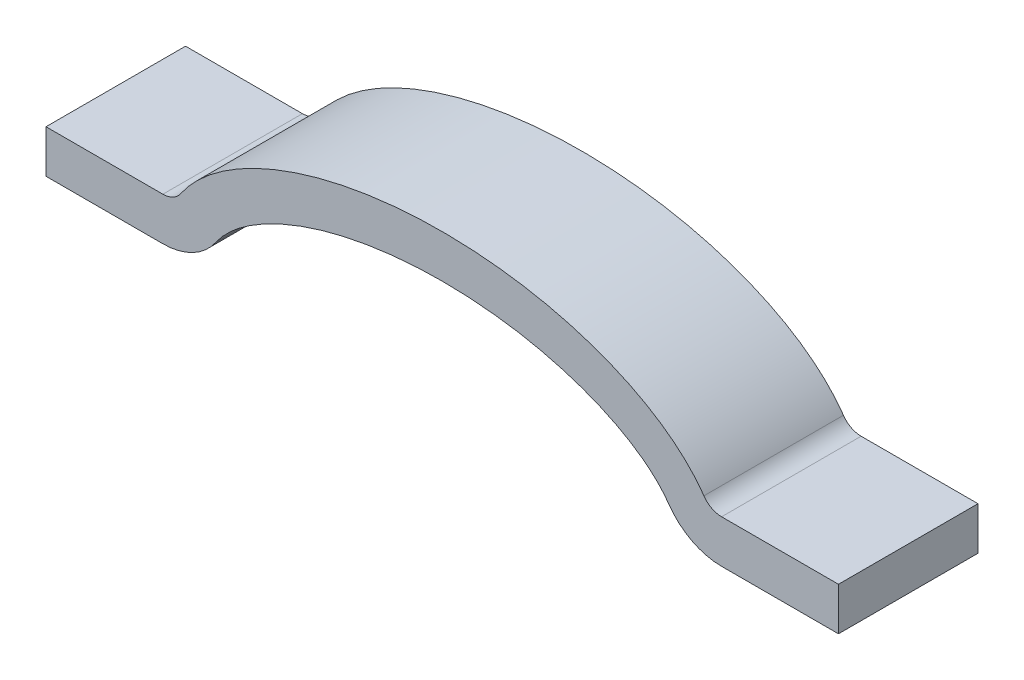
ISO-10303-21;
HEADER;
FILE_DESCRIPTION(('STEP AP214'),'2;1');
FILE_NAME('part.step','',(''),(''),'','','');
FILE_SCHEMA(('AUTOMOTIVE_DESIGN { 1 0 10303 214 1 1 1 1 }'));
ENDSEC;
DATA;
#1=APPLICATION_CONTEXT('core data for automotive mechanical design processes');
#2=APPLICATION_PROTOCOL_DEFINITION('international standard','automotive_design',2000,#1);
#3=PRODUCT_CONTEXT('',#1,'mechanical');
#4=PRODUCT('Part','Part','',(#3));
#5=PRODUCT_RELATED_PRODUCT_CATEGORY('part','',(#4));
#6=PRODUCT_DEFINITION_FORMATION('','',#4);
#7=PRODUCT_DEFINITION_CONTEXT('part definition',#1,'design');
#8=PRODUCT_DEFINITION('design','',#6,#7);
#9=PRODUCT_DEFINITION_SHAPE('','',#8);
#10=(LENGTH_UNIT() NAMED_UNIT(*) SI_UNIT(.MILLI.,.METRE.));
#11=(NAMED_UNIT(*) PLANE_ANGLE_UNIT() SI_UNIT($,.RADIAN.));
#12=(NAMED_UNIT(*) SI_UNIT($,.STERADIAN.) SOLID_ANGLE_UNIT());
#13=UNCERTAINTY_MEASURE_WITH_UNIT(LENGTH_MEASURE(1.E-05),#10,'distance_accuracy_value','');
#14=(GEOMETRIC_REPRESENTATION_CONTEXT(3) GLOBAL_UNCERTAINTY_ASSIGNED_CONTEXT((#13)) GLOBAL_UNIT_ASSIGNED_CONTEXT((#10,
#11,#12)) REPRESENTATION_CONTEXT('',''));
#15=CARTESIAN_POINT('',(0.,0.,0.));
#16=DIRECTION('',(0.,0.,1.));
#17=DIRECTION('',(1.,0.,0.));
#18=AXIS2_PLACEMENT_3D('',#15,#16,#17);
#19=CARTESIAN_POINT('',(36.9161860349977,0.,13.));
#20=DIRECTION('',(1.,0.,0.));
#21=DIRECTION('',(0.,0.,-1.));
#22=AXIS2_PLACEMENT_3D('',#19,#20,#21);
#23=PLANE('',#22);
#24=DIRECTION('',(0.,-1.,0.));
#25=VECTOR('',#24,1.);
#26=CARTESIAN_POINT('',(36.9161860349977,0.,0.));
#27=LINE('',#26,#25);
#28=CARTESIAN_POINT('',(36.9161860349977,4.,0.));
#29=VERTEX_POINT('',#28);
#30=CARTESIAN_POINT('',(36.9161860349977,0.,0.));
#31=VERTEX_POINT('',#30);
#32=EDGE_CURVE('E11',#29,#31,#27,.T.);
#33=ORIENTED_EDGE('',*,*,#32,.F.);
#34=DIRECTION('',(0.,0.,1.));
#35=VECTOR('',#34,1.);
#36=CARTESIAN_POINT('',(36.9161860349977,4.,13.));
#37=LINE('',#36,#35);
#38=CARTESIAN_POINT('',(36.9161860349977,4.,13.));
#39=VERTEX_POINT('',#38);
#40=EDGE_CURVE('E108',#39,#29,#37,.F.);
#41=ORIENTED_EDGE('',*,*,#40,.F.);
#42=DIRECTION('',(0.,-1.,0.));
#43=VECTOR('',#42,1.);
#44=CARTESIAN_POINT('',(36.9161860349977,0.,13.));
#45=LINE('',#44,#43);
#46=CARTESIAN_POINT('',(36.9161860349977,0.,13.));
#47=VERTEX_POINT('',#46);
#48=EDGE_CURVE('E46',#39,#47,#45,.T.);
#49=ORIENTED_EDGE('',*,*,#48,.T.);
#50=DIRECTION('',(0.,0.,-1.));
#51=VECTOR('',#50,1.);
#52=CARTESIAN_POINT('',(36.9161860349977,0.,13.));
#53=LINE('',#52,#51);
#54=EDGE_CURVE('E140',#47,#31,#53,.T.);
#55=ORIENTED_EDGE('',*,*,#54,.T.);
#56=EDGE_LOOP('',(#33,#41,#49,#55));
#57=FACE_BOUND('',#56,.T.);
#58=ADVANCED_FACE('F37',(#57),#23,.T.);
#59=CARTESIAN_POINT('',(-22.,0.,13.));
#60=DIRECTION('',(0.,0.,1.));
#61=DIRECTION('',(1.,0.,0.));
#62=AXIS2_PLACEMENT_3D('',#59,#60,#61);
#63=PLANE('',#62);
#64=DIRECTION('',(1.,0.,0.));
#65=VECTOR('',#64,1.);
#66=CARTESIAN_POINT('',(-22.,0.,13.));
#67=LINE('',#66,#65);
#68=CARTESIAN_POINT('',(-36.9161860349977,0.,13.));
#69=VERTEX_POINT('',#68);
#70=CARTESIAN_POINT('',(-26.0263948261629,0.,13.));
#71=VERTEX_POINT('',#70);
#72=EDGE_CURVE('E163',#69,#71,#67,.T.);
#73=ORIENTED_EDGE('',*,*,#72,.T.);
#74=CARTESIAN_POINT('',(-26.0263948261629,5.99999999999997,13.));
#75=DIRECTION('',(0.,0.,-1.));
#76=DIRECTION('',(-1.,0.,0.));
#77=AXIS2_PLACEMENT_3D('',#74,#75,#76);
#78=CIRCLE('',#77,6.);
#79=CARTESIAN_POINT('',(-21.083393892477,2.59900870780584,13.));
#80=VERTEX_POINT('',#79);
#81=EDGE_CURVE('E54',#71,#80,#78,.F.);
#82=ORIENTED_EDGE('',*,*,#81,.T.);
#83=CARTESIAN_POINT('',(-22.,0.,13.));
#84=CARTESIAN_POINT('',(-22.,0.432036641839711,13.));
#85=CARTESIAN_POINT('',(-21.8548863619666,1.29610992551914,13.));
#86=CARTESIAN_POINT('',(-20.9973878430744,2.88664464705841,13.));
#87=CARTESIAN_POINT('',(-19.2580049467167,4.66938679657808,13.));
#88=CARTESIAN_POINT('',(-15.7412521676776,6.99878575691308,13.));
#89=CARTESIAN_POINT('',(-9.3643610379705,9.3281522587363,13.));
#90=CARTESIAN_POINT('',(0.,10.3359238706319,13.));
#91=CARTESIAN_POINT('',(9.36436103797051,9.3281522587363,13.));
#92=CARTESIAN_POINT('',(15.7412521676776,6.99878575691308,13.));
#93=CARTESIAN_POINT('',(19.2580049467167,4.66938679657808,13.));
#94=CARTESIAN_POINT('',(20.9973878430744,2.8866446470584,13.));
#95=CARTESIAN_POINT('',(21.8548863619666,1.29610992551914,13.));
#96=CARTESIAN_POINT('',(22.,0.432036641839715,13.));
#97=CARTESIAN_POINT('',(22.,0.,13.));
#98=B_SPLINE_CURVE_WITH_KNOTS('',3,(#83,#84,#85,#86,#87,#88,#89,#90,#91,#92,#93,#94,#95,#96,
#97),.UNSPECIFIED.,.F.,.F.,(4,1,1,1,1,1,1,1,1,1,1,1,4),(3.14159265358979,3.33794219443916,
3.53429173528852,3.73064127613788,3.92699081698724,4.31968989868597,4.71238898038469,
5.10508806208341,5.49778714378214,5.6941366846315,5.89048622548086,6.08683576633022,
6.28318530717959),.UNSPECIFIED.);
#99=CARTESIAN_POINT('',(21.083393892477,2.59900870780584,13.));
#100=VERTEX_POINT('',#99);
#101=EDGE_CURVE('E164',#80,#100,#98,.T.);
#102=ORIENTED_EDGE('',*,*,#101,.T.);
#103=CARTESIAN_POINT('',(26.0263948261629,5.99999999999997,13.));
#104=DIRECTION('',(0.,0.,-1.));
#105=DIRECTION('',(-1.,0.,0.));
#106=AXIS2_PLACEMENT_3D('',#103,#104,#105);
#107=CIRCLE('',#106,6.);
#108=CARTESIAN_POINT('',(26.0263948261629,0.,13.));
#109=VERTEX_POINT('',#108);
#110=EDGE_CURVE('E161',#100,#109,#107,.F.);
#111=ORIENTED_EDGE('',*,*,#110,.T.);
#112=DIRECTION('',(1.,0.,0.));
#113=VECTOR('',#112,1.);
#114=CARTESIAN_POINT('',(22.,0.,13.));
#115=LINE('',#114,#113);
#116=EDGE_CURVE('E152',#109,#47,#115,.T.);
#117=ORIENTED_EDGE('',*,*,#116,.T.);
#118=ORIENTED_EDGE('',*,*,#48,.F.);
#119=DIRECTION('',(-1.,0.,0.));
#120=VECTOR('',#119,1.);
#121=CARTESIAN_POINT('',(22.,4.,13.));
#122=LINE('',#121,#120);
#123=CARTESIAN_POINT('',(26.0263948261629,4.,13.));
#124=VERTEX_POINT('',#123);
#125=EDGE_CURVE('E232',#124,#39,#122,.F.);
#126=ORIENTED_EDGE('',*,*,#125,.F.);
#127=CARTESIAN_POINT('',(26.0263948261629,5.99999999999997,13.));
#128=DIRECTION('',(0.,0.,-1.));
#129=DIRECTION('',(-1.,0.,0.));
#130=AXIS2_PLACEMENT_3D('',#127,#128,#129);
#131=CIRCLE('',#130,2.);
#132=CARTESIAN_POINT('',(24.3787278482676,4.86633623593526,13.));
#133=VERTEX_POINT('',#132);
#134=EDGE_CURVE('E103',#133,#124,#131,.F.);
#135=ORIENTED_EDGE('',*,*,#134,.F.);
#136=CARTESIAN_POINT('',(-26.,-5.25591541948676E-09,13.));
#137=CARTESIAN_POINT('',(-26.0000116676451,0.111537247286349,13.));
#138=CARTESIAN_POINT('',(-25.9976258289216,0.223078285323674,13.));
#139=CARTESIAN_POINT('',(-25.9878872850968,0.448666430823199,13.));
#140=CARTESIAN_POINT('',(-25.9804149655458,0.56270837405115,13.));
#141=CARTESIAN_POINT('',(-25.9601396738284,0.792413314224165,13.));
#142=CARTESIAN_POINT('',(-25.9472420470309,0.908067983077297,13.));
#143=CARTESIAN_POINT('',(-25.915945897434,1.14006903279323,13.));
#144=CARTESIAN_POINT('',(-25.8974821013963,1.25640660479358,13.));
#145=CARTESIAN_POINT('',(-25.8550595671101,1.48888395466193,13.));
#146=CARTESIAN_POINT('',(-25.8310646704827,1.6050171275041,13.));
#147=CARTESIAN_POINT('',(-25.7777484707093,1.83630999130887,13.));
#148=CARTESIAN_POINT('',(-25.7484160494636,1.95146711504999,13.));
#149=CARTESIAN_POINT('',(-25.6847150602839,2.18020284317876,13.));
#150=CARTESIAN_POINT('',(-25.6503536260085,2.29378343805561,13.));
#151=CARTESIAN_POINT('',(-25.576956710448,2.51896209143195,13.));
#152=CARTESIAN_POINT('',(-25.5379387429657,2.63056587201652,13.));
#153=CARTESIAN_POINT('',(-25.4552024021435,2.85270133325781,13.));
#154=CARTESIAN_POINT('',(-25.4114597755304,2.96322396550021,13.));
#155=CARTESIAN_POINT('',(-25.3189473938992,3.18415346660159,13.));
#156=CARTESIAN_POINT('',(-25.2701104006534,3.2945321547338,13.));
#157=CARTESIAN_POINT('',(-25.1674048004263,3.5150226557403,13.));
#158=CARTESIAN_POINT('',(-25.1134695287242,3.62510338377648,13.));
#159=CARTESIAN_POINT('',(-25.0005687603073,3.84486090717794,13.));
#160=CARTESIAN_POINT('',(-24.9415371214083,3.9545036889688,13.));
#161=CARTESIAN_POINT('',(-24.8184478876507,4.17326325245095,13.));
#162=CARTESIAN_POINT('',(-24.7543245859132,4.28234302730507,13.));
#163=CARTESIAN_POINT('',(-24.6210568142596,4.49987062809492,13.));
#164=CARTESIAN_POINT('',(-24.551846981188,4.60827837147226,13.));
#165=CARTESIAN_POINT('',(-24.4084091092638,4.82437233822117,13.));
#166=CARTESIAN_POINT('',(-24.3341159707699,4.93201530889777,13.));
#167=CARTESIAN_POINT('',(-24.1805098064464,5.1465060090048,13.));
#168=CARTESIAN_POINT('',(-24.1011318763264,5.25330721555847,13.));
#169=CARTESIAN_POINT('',(-23.9376358793378,5.465685050551,13.));
#170=CARTESIAN_POINT('',(-23.8534658733088,5.57122165086724,13.));
#171=CARTESIAN_POINT('',(-23.6806810325843,5.78080997511271,13.));
#172=CARTESIAN_POINT('',(-23.5920238340478,5.88482672709309,13.));
#173=CARTESIAN_POINT('',(-23.4102450544272,6.09150776484632,13.));
#174=CARTESIAN_POINT('',(-23.3170780484472,6.19413207563363,13.));
#175=CARTESIAN_POINT('',(-23.1262558984359,6.39810968013806,13.));
#176=CARTESIAN_POINT('',(-23.0285536250027,6.49941876570225,13.));
#177=CARTESIAN_POINT('',(-22.7261165515322,6.80408823826286,13.));
#178=CARTESIAN_POINT('',(-22.5167459416307,7.00287359830188,13.));
#179=CARTESIAN_POINT('',(-22.0798868853556,7.39575577415625,13.));
#180=CARTESIAN_POINT('',(-21.8520176546229,7.58942688279915,13.));
#181=CARTESIAN_POINT('',(-21.3789946630926,7.97090126508661,13.));
#182=CARTESIAN_POINT('',(-21.13351925821,8.15830480213568,13.));
#183=CARTESIAN_POINT('',(-20.6264401691121,8.52651690174705,13.));
#184=CARTESIAN_POINT('',(-20.3645738543199,8.7069625142317,13.));
#185=CARTESIAN_POINT('',(-19.8247588027536,9.06125072564397,13.));
#186=CARTESIAN_POINT('',(-19.546563156856,9.2347161911291,13.));
#187=CARTESIAN_POINT('',(-18.9741946965365,9.57474769189839,13.));
#188=CARTESIAN_POINT('',(-18.6797941952976,9.74092968282077,13.));
#189=CARTESIAN_POINT('',(-18.0763789806,10.0652540159631,13.));
#190=CARTESIAN_POINT('',(-17.7671841379604,10.2230603717114,13.));
#191=CARTESIAN_POINT('',(-17.1358146082921,10.5301159281395,13.));
#192=CARTESIAN_POINT('',(-16.8135048236157,10.6790864692833,13.));
#193=CARTESIAN_POINT('',(-16.1563567979412,10.9685343106685,13.));
#194=CARTESIAN_POINT('',(-15.8214002132375,11.1087422747537,13.));
#195=CARTESIAN_POINT('',(-15.1394655070584,11.380573016466,13.));
#196=CARTESIAN_POINT('',(-14.7923851076409,11.5119386431155,13.));
#197=CARTESIAN_POINT('',(-14.086757023152,11.7658746909795,13.));
#198=CARTESIAN_POINT('',(-13.7281218143803,11.88820144439,13.));
#199=CARTESIAN_POINT('',(-12.9999804917653,12.1237597026379,13.));
#200=CARTESIAN_POINT('',(-12.6304001582384,12.2367614083769,13.));
#201=CARTESIAN_POINT('',(-11.8810004293432,12.4532996975759,13.));
#202=CARTESIAN_POINT('',(-11.501118686008,12.5566202125045,13.));
#203=CARTESIAN_POINT('',(-10.7317776314485,12.7533690968808,13.));
#204=CARTESIAN_POINT('',(-10.3422665196632,12.846594671185,13.));
#205=CARTESIAN_POINT('',(-9.55512700269836,13.0225123751248,13.));
#206=CARTESIAN_POINT('',(-9.15746143610106,13.1050381251034,13.));
#207=CARTESIAN_POINT('',(-8.35560256669944,13.2593762182577,13.));
#208=CARTESIAN_POINT('',(-7.95138522936855,13.331062741599,13.));
#209=CARTESIAN_POINT('',(-6.72488526673784,13.5309431058362,13.));
#210=CARTESIAN_POINT('',(-5.89967836668501,13.6415405098872,13.));
#211=CARTESIAN_POINT('',(-4.23333341247432,13.8198639361473,13.));
#212=CARTESIAN_POINT('',(-3.39213171827096,13.8869837014631,13.));
#213=CARTESIAN_POINT('',(-1.70063272261015,13.9772291723469,13.));
#214=CARTESIAN_POINT('',(-0.850316361305075,14.,13.));
#215=CARTESIAN_POINT('',(0.850316361304433,14.,13.));
#216=CARTESIAN_POINT('',(1.70063272260886,13.977229172347,13.));
#217=CARTESIAN_POINT('',(3.39213171826967,13.8869837014632,13.));
#218=CARTESIAN_POINT('',(4.23333341247369,13.8198639361473,13.));
#219=CARTESIAN_POINT('',(5.89967836667695,13.6415405098881,13.));
#220=CARTESIAN_POINT('',(6.72488526672175,13.5309431058383,13.));
#221=CARTESIAN_POINT('',(7.95138522934303,13.3310627416034,13.));
#222=CARTESIAN_POINT('',(8.35560256667242,13.2593762182626,13.));
#223=CARTESIAN_POINT('',(9.15746143609327,13.1050381251052,13.));
#224=CARTESIAN_POINT('',(9.55512700271117,13.0225123751223,13.));
#225=CARTESIAN_POINT('',(10.342266519711,12.846594671174,13.));
#226=CARTESIAN_POINT('',(10.7317776315108,12.7533690968658,13.));
#227=CARTESIAN_POINT('',(11.5011186860734,12.556620212487,13.));
#228=CARTESIAN_POINT('',(11.8810004293976,12.4532996975607,13.));
#229=CARTESIAN_POINT('',(12.6304001582672,12.2367614083681,13.));
#230=CARTESIAN_POINT('',(12.9999804917797,12.1237597026333,13.));
#231=CARTESIAN_POINT('',(13.7281218143619,11.888201444396,13.));
#232=CARTESIAN_POINT('',(14.0867570231153,11.7658746909921,13.));
#233=CARTESIAN_POINT('',(14.7923851076046,11.5119386431292,13.));
#234=CARTESIAN_POINT('',(15.1394655070404,11.3805730164732,13.));
#235=CARTESIAN_POINT('',(15.8214002133122,11.1087422747239,13.));
#236=CARTESIAN_POINT('',(16.1563567980896,10.9685343106064,13.));
#237=CARTESIAN_POINT('',(16.8135048237357,10.6790864692273,13.));
#238=CARTESIAN_POINT('',(17.1358146083127,10.5301159281282,13.));
#239=CARTESIAN_POINT('',(17.7671841378536,10.2230603717646,13.));
#240=CARTESIAN_POINT('',(18.0763789804637,10.0652540160334,13.));
#241=CARTESIAN_POINT('',(18.6797941951791,9.74092968288742,13.));
#242=CARTESIAN_POINT('',(18.9741946964635,9.57474769194123,13.));
#243=CARTESIAN_POINT('',(19.5465631567266,9.23471619120654,13.));
#244=CARTESIAN_POINT('',(19.8247588025261,9.06125072578613,13.));
#245=CARTESIAN_POINT('',(20.3645738540333,8.70696251442677,13.));
#246=CARTESIAN_POINT('',(20.6264401688605,8.52651690192429,13.));
#247=CARTESIAN_POINT('',(21.1335192580166,8.1583048022814,13.));
#248=CARTESIAN_POINT('',(21.3789946629229,7.97090126521917,13.));
#249=CARTESIAN_POINT('',(21.8520176544375,7.58942688295277,13.));
#250=CARTESIAN_POINT('',(22.0798868851335,7.3957557743473,13.));
#251=CARTESIAN_POINT('',(22.5167459416699,7.00287359827503,13.));
#252=CARTESIAN_POINT('',(22.7261165518533,6.80408823796273,13.));
#253=CARTESIAN_POINT('',(23.0285536251686,6.49941876552382,13.));
#254=CARTESIAN_POINT('',(23.126255898194,6.3981096803828,13.));
#255=CARTESIAN_POINT('',(23.3170780480187,6.19413207610534,13.));
#256=CARTESIAN_POINT('',(23.4102450542003,6.09150776510358,13.));
#257=CARTESIAN_POINT('',(23.5920238341204,5.88482672701131,13.));
#258=CARTESIAN_POINT('',(23.6806810327581,5.78080997490921,13.));
#259=CARTESIAN_POINT('',(23.8534658733679,5.5712216507883,13.));
#260=CARTESIAN_POINT('',(23.9376358791933,5.4656850507284,13.));
#261=CARTESIAN_POINT('',(24.1011318761151,5.25330721584322,13.));
#262=CARTESIAN_POINT('',(24.1805098063578,5.14650600912951,13.));
#263=CARTESIAN_POINT('',(24.3341159706946,4.93201530900185,13.));
#264=CARTESIAN_POINT('',(24.40840910909,4.82437233847237,13.));
#265=CARTESIAN_POINT('',(24.5518469807964,4.60827837207256,13.));
#266=CARTESIAN_POINT('',(24.6210568137503,4.49987062889827,13.));
#267=CARTESIAN_POINT('',(24.7543245855127,4.28234302798651,13.));
#268=CARTESIAN_POINT('',(24.8184478874569,4.17326325279536,13.));
#269=CARTESIAN_POINT('',(24.9415371216399,3.95450368855732,13.));
#270=CARTESIAN_POINT('',(25.000568760755,3.84486090634631,13.));
#271=CARTESIAN_POINT('',(25.1134695291365,3.62510338293474,13.));
#272=CARTESIAN_POINT('',(25.1674048006193,3.51502265532528,13.));
#273=CARTESIAN_POINT('',(25.2701104007492,3.29453215452878,13.));
#274=CARTESIAN_POINT('',(25.3189473940913,3.18415346616786,13.));
#275=CARTESIAN_POINT('',(25.4114597756033,2.96322396530142,13.));
#276=CARTESIAN_POINT('',(25.4552024020288,2.85270133353429,13.));
#277=CARTESIAN_POINT('',(25.5379387427875,2.63056587252623,13.));
#278=CARTESIAN_POINT('',(25.5769567103644,2.51896209168857,13.));
#279=CARTESIAN_POINT('',(25.6503536260101,2.29378343805051,13.));
#280=CARTESIAN_POINT('',(25.684715060287,2.18020284316853,13.));
#281=CARTESIAN_POINT('',(25.7484160493808,1.95146711534656,13.));
#282=CARTESIAN_POINT('',(25.7777484705532,1.83630999192129,13.));
#283=CARTESIAN_POINT('',(25.83106467028,1.60501712844776,13.));
#284=CARTESIAN_POINT('',(25.8550595669203,1.48888395561773,13.));
#285=CARTESIAN_POINT('',(25.8974821012935,1.25640660544136,13.));
#286=CARTESIAN_POINT('',(25.9159458973902,1.14006903311805,13.));
#287=CARTESIAN_POINT('',(25.9472420469846,0.908067983421301,13.));
#288=CARTESIAN_POINT('',(25.9601396737515,0.792413314914489,13.));
#289=CARTESIAN_POINT('',(25.9804149655618,0.562708374048563,13.));
#290=CARTESIAN_POINT('',(25.9878872851732,0.448666429775861,13.));
#291=CARTESIAN_POINT('',(25.9976258289061,0.223078284976777,13.));
#292=CARTESIAN_POINT('',(26.0000116675999,0.111537248689892,13.));
#293=CARTESIAN_POINT('',(26.,-2.10236242051774E-09,13.));
#294=B_SPLINE_CURVE_WITH_KNOTS('',3,(#136,#137,#138,#139,#140,#141,#142,#143,#144,#145,#146,
#147,#148,#149,#150,#151,#152,#153,#154,#155,#156,#157,#158,#159,#160,#161,#162,#163,#164,#165,
#166,#167,#168,#169,#170,#171,#172,#173,#174,#175,#176,#177,#178,#179,#180,#181,#182,#183,#184,
#185,#186,#187,#188,#189,#190,#191,#192,#193,#194,#195,#196,#197,#198,#199,#200,#201,#202,#203,
#204,#205,#206,#207,#208,#209,#210,#211,#212,#213,#214,#215,#216,#217,#218,#219,#220,#221,#222,
#223,#224,#225,#226,#227,#228,#229,#230,#231,#232,#233,#234,#235,#236,#237,#238,#239,#240,#241,
#242,#243,#244,#245,#246,#247,#248,#249,#250,#251,#252,#253,#254,#255,#256,#257,#258,#259,#260,
#261,#262,#263,#264,#265,#266,#267,#268,#269,#270,#271,#272,#273,#274,#275,#276,#277,#278,#279,
#280,#281,#282,#283,#284,#285,#286,#287,#288,#289,#290,#291,#292,#293),.UNSPECIFIED.,.F.,.F.,(4,
2,2,2,2,2,2,2,2,2,2,2,2,2,2,2,2,2,2,2,2,2,2,2,2,2,2,2,2,2,2,2,2,2,2,2,2,2,2,2,2,2,2,2,2,2,2,2,2,
2,2,2,2,2,2,2,2,2,2,2,2,2,2,2,2,2,2,2,2,2,2,2,2,2,2,2,2,2,4),(0.,0.334591789746542,
0.677336812858055,1.02632737627372,1.37958114205443,1.73521322792134,2.09159475891316,
2.44747557596909,2.80205773509361,3.1585553708871,3.52056192024408,3.88822160551874,
4.26170458649938,4.64121147442852,5.02697649710909,5.41926944722264,5.8183965570049,
6.22329407200158,6.63324503470354,7.04899786213921,7.47118101830255,8.33679232254686,
9.2335334475586,10.1596351408929,11.1133345604709,12.0965467306585,13.1104308997004,
14.1515568356346,15.2165209576283,16.3056441657962,17.4187588005548,18.5553293801477,
19.7145470935532,20.8954045060722,22.0967554563243,23.3149837249181,24.5464165421089,
27.0427967760967,29.5732773915513,32.1239249127651,34.6745724339769,37.2050530494334,
39.7014332833969,40.932866100583,42.15109436924,43.352445319537,44.5333027320222,
45.6925204453825,46.8290910249172,47.9422056597339,49.031328868143,50.0962929898102,
51.1374189256425,52.1513030948383,53.1345152646738,54.0882146843685,55.014316377783,
55.9110575026386,56.7766688080581,57.1988519624594,57.6146047907775,58.024555753954,
58.4294532679691,58.8285803783557,59.2208733279385,59.6066383499161,59.9861452390305,
60.3596282214272,60.7272879052643,61.0892944553647,61.4457920896268,61.8003742495608,
62.1562550666327,62.512636596653,62.8682686824921,63.2215224492561,63.5705130116307,
63.9132580378779,64.247849822377),.UNSPECIFIED.);
#295=CARTESIAN_POINT('',(-24.3787278482676,4.86633623593526,13.));
#296=VERTEX_POINT('',#295);
#297=EDGE_CURVE('E227',#296,#133,#294,.T.);
#298=ORIENTED_EDGE('',*,*,#297,.F.);
#299=CARTESIAN_POINT('',(-26.0263948261629,5.99999999999997,13.));
#300=DIRECTION('',(0.,0.,-1.));
#301=DIRECTION('',(-1.,0.,0.));
#302=AXIS2_PLACEMENT_3D('',#299,#300,#301);
#303=CIRCLE('',#302,2.);
#304=CARTESIAN_POINT('',(-26.0263948261629,3.99999999999997,13.));
#305=VERTEX_POINT('',#304);
#306=EDGE_CURVE('E233',#305,#296,#303,.F.);
#307=ORIENTED_EDGE('',*,*,#306,.F.);
#308=DIRECTION('',(-1.,0.,0.));
#309=VECTOR('',#308,1.);
#310=CARTESIAN_POINT('',(-22.,4.,13.));
#311=LINE('',#310,#309);
#312=CARTESIAN_POINT('',(-36.9161860349977,4.,13.));
#313=VERTEX_POINT('',#312);
#314=EDGE_CURVE('E241',#313,#305,#311,.F.);
#315=ORIENTED_EDGE('',*,*,#314,.F.);
#316=DIRECTION('',(0.,-1.,0.));
#317=VECTOR('',#316,1.);
#318=CARTESIAN_POINT('',(-36.9161860349977,0.,13.));
#319=LINE('',#318,#317);
#320=EDGE_CURVE('E132',#313,#69,#319,.T.);
#321=ORIENTED_EDGE('',*,*,#320,.T.);
#322=EDGE_LOOP('',(#73,#82,#102,#111,#117,#118,#126,#135,#298,#307,#315,#321));
#323=FACE_BOUND('',#322,.T.);
#324=ADVANCED_FACE('F159',(#323),#63,.T.);
#325=CARTESIAN_POINT('',(-36.9161860349977,0.,13.));
#326=DIRECTION('',(1.,0.,0.));
#327=DIRECTION('',(0.,0.,-1.));
#328=AXIS2_PLACEMENT_3D('',#325,#326,#327);
#329=PLANE('',#328);
#330=ORIENTED_EDGE('',*,*,#320,.F.);
#331=DIRECTION('',(0.,0.,1.));
#332=VECTOR('',#331,1.);
#333=CARTESIAN_POINT('',(-36.9161860349977,4.,13.));
#334=LINE('',#333,#332);
#335=CARTESIAN_POINT('',(-36.9161860349977,4.,0.));
#336=VERTEX_POINT('',#335);
#337=EDGE_CURVE('E242',#313,#336,#334,.F.);
#338=ORIENTED_EDGE('',*,*,#337,.T.);
#339=DIRECTION('',(0.,-1.,0.));
#340=VECTOR('',#339,1.);
#341=CARTESIAN_POINT('',(-36.9161860349977,0.,0.));
#342=LINE('',#341,#340);
#343=CARTESIAN_POINT('',(-36.9161860349977,0.,0.));
#344=VERTEX_POINT('',#343);
#345=EDGE_CURVE('E129',#336,#344,#342,.T.);
#346=ORIENTED_EDGE('',*,*,#345,.T.);
#347=DIRECTION('',(0.,0.,-1.));
#348=VECTOR('',#347,1.);
#349=CARTESIAN_POINT('',(-36.9161860349977,0.,13.));
#350=LINE('',#349,#348);
#351=EDGE_CURVE('E157',#69,#344,#350,.T.);
#352=ORIENTED_EDGE('',*,*,#351,.F.);
#353=EDGE_LOOP('',(#330,#338,#346,#352));
#354=FACE_BOUND('',#353,.T.);
#355=ADVANCED_FACE('F267',(#354),#329,.F.);
#356=CARTESIAN_POINT('',(26.0263948261629,5.99999999999997,0.));
#357=DIRECTION('',(0.,0.,1.));
#358=DIRECTION('',(1.,0.,0.));
#359=AXIS2_PLACEMENT_3D('',#356,#357,#358);
#360=PLANE('',#359);
#361=CARTESIAN_POINT('',(26.0263948261629,5.99999999999997,0.));
#362=DIRECTION('',(0.,0.,-1.));
#363=DIRECTION('',(-1.,0.,0.));
#364=AXIS2_PLACEMENT_3D('',#361,#362,#363);
#365=CIRCLE('',#364,2.);
#366=CARTESIAN_POINT('',(26.0263948261629,3.99999999999997,0.));
#367=VERTEX_POINT('',#366);
#368=CARTESIAN_POINT('',(24.3787278482676,4.86633623593526,0.));
#369=VERTEX_POINT('',#368);
#370=EDGE_CURVE('E100',#367,#369,#365,.T.);
#371=ORIENTED_EDGE('',*,*,#370,.F.);
#372=DIRECTION('',(-1.,0.,0.));
#373=VECTOR('',#372,1.);
#374=CARTESIAN_POINT('',(22.,4.,0.));
#375=LINE('',#374,#373);
#376=EDGE_CURVE('E112',#367,#29,#375,.F.);
#377=ORIENTED_EDGE('',*,*,#376,.T.);
#378=ORIENTED_EDGE('',*,*,#32,.T.);
#379=DIRECTION('',(1.,0.,0.));
#380=VECTOR('',#379,1.);
#381=CARTESIAN_POINT('',(22.,0.,0.));
#382=LINE('',#381,#380);
#383=CARTESIAN_POINT('',(26.0263948261629,0.,0.));
#384=VERTEX_POINT('',#383);
#385=EDGE_CURVE('E155',#384,#31,#382,.T.);
#386=ORIENTED_EDGE('',*,*,#385,.F.);
#387=CARTESIAN_POINT('',(26.0263948261629,5.99999999999997,0.));
#388=DIRECTION('',(0.,0.,-1.));
#389=DIRECTION('',(-1.,0.,0.));
#390=AXIS2_PLACEMENT_3D('',#387,#388,#389);
#391=CIRCLE('',#390,6.);
#392=CARTESIAN_POINT('',(21.083393892477,2.59900870780584,0.));
#393=VERTEX_POINT('',#392);
#394=EDGE_CURVE('E188',#384,#393,#391,.T.);
#395=ORIENTED_EDGE('',*,*,#394,.T.);
#396=CARTESIAN_POINT('',(-22.,0.,0.));
#397=CARTESIAN_POINT('',(-22.,0.432036641839711,0.));
#398=CARTESIAN_POINT('',(-21.8548863619666,1.29610992551914,0.));
#399=CARTESIAN_POINT('',(-20.9973878430744,2.88664464705841,0.));
#400=CARTESIAN_POINT('',(-19.2580049467167,4.66938679657808,0.));
#401=CARTESIAN_POINT('',(-15.7412521676776,6.99878575691308,0.));
#402=CARTESIAN_POINT('',(-9.3643610379705,9.3281522587363,0.));
#403=CARTESIAN_POINT('',(0.,10.3359238706319,0.));
#404=CARTESIAN_POINT('',(9.36436103797051,9.3281522587363,0.));
#405=CARTESIAN_POINT('',(15.7412521676776,6.99878575691308,0.));
#406=CARTESIAN_POINT('',(19.2580049467167,4.66938679657808,0.));
#407=CARTESIAN_POINT('',(20.9973878430744,2.8866446470584,0.));
#408=CARTESIAN_POINT('',(21.8548863619666,1.29610992551914,0.));
#409=CARTESIAN_POINT('',(22.,0.432036641839715,0.));
#410=CARTESIAN_POINT('',(22.,0.,0.));
#411=B_SPLINE_CURVE_WITH_KNOTS('',3,(#396,#397,#398,#399,#400,#401,#402,#403,#404,#405,#406,
#407,#408,#409,#410),.UNSPECIFIED.,.F.,.F.,(4,1,1,1,1,1,1,1,1,1,1,1,4),(3.14159265358979,
3.33794219443916,3.53429173528852,3.73064127613788,3.92699081698724,4.31968989868597,
4.71238898038469,5.10508806208341,5.49778714378214,5.6941366846315,5.89048622548086,
6.08683576633022,6.28318530717959),.UNSPECIFIED.);
#412=CARTESIAN_POINT('',(-21.083393892477,2.59900870780584,0.));
#413=VERTEX_POINT('',#412);
#414=EDGE_CURVE('E170',#413,#393,#411,.T.);
#415=ORIENTED_EDGE('',*,*,#414,.F.);
#416=CARTESIAN_POINT('',(-26.0263948261629,5.99999999999997,0.));
#417=DIRECTION('',(0.,0.,-1.));
#418=DIRECTION('',(-1.,0.,0.));
#419=AXIS2_PLACEMENT_3D('',#416,#417,#418);
#420=CIRCLE('',#419,6.);
#421=CARTESIAN_POINT('',(-26.0263948261629,0.,0.));
#422=VERTEX_POINT('',#421);
#423=EDGE_CURVE('E185',#413,#422,#420,.T.);
#424=ORIENTED_EDGE('',*,*,#423,.T.);
#425=DIRECTION('',(1.,0.,0.));
#426=VECTOR('',#425,1.);
#427=CARTESIAN_POINT('',(-22.,0.,0.));
#428=LINE('',#427,#426);
#429=EDGE_CURVE('E167',#344,#422,#428,.T.);
#430=ORIENTED_EDGE('',*,*,#429,.F.);
#431=ORIENTED_EDGE('',*,*,#345,.F.);
#432=DIRECTION('',(-1.,0.,0.));
#433=VECTOR('',#432,1.);
#434=CARTESIAN_POINT('',(-22.,4.,0.));
#435=LINE('',#434,#433);
#436=CARTESIAN_POINT('',(-26.0263948261629,4.,0.));
#437=VERTEX_POINT('',#436);
#438=EDGE_CURVE('E116',#336,#437,#435,.F.);
#439=ORIENTED_EDGE('',*,*,#438,.T.);
#440=CARTESIAN_POINT('',(-26.0263948261629,5.99999999999997,0.));
#441=DIRECTION('',(0.,0.,-1.));
#442=DIRECTION('',(-1.,0.,0.));
#443=AXIS2_PLACEMENT_3D('',#440,#441,#442);
#444=CIRCLE('',#443,2.);
#445=CARTESIAN_POINT('',(-24.3787278482676,4.86633623593526,0.));
#446=VERTEX_POINT('',#445);
#447=EDGE_CURVE('E107',#446,#437,#444,.T.);
#448=ORIENTED_EDGE('',*,*,#447,.F.);
#449=CARTESIAN_POINT('',(-26.,-5.25591541948676E-09,0.));
#450=CARTESIAN_POINT('',(-26.0000116676451,0.111537247286349,0.));
#451=CARTESIAN_POINT('',(-25.9976258289216,0.223078285323674,0.));
#452=CARTESIAN_POINT('',(-25.9878872850968,0.448666430823199,0.));
#453=CARTESIAN_POINT('',(-25.9804149655458,0.56270837405115,0.));
#454=CARTESIAN_POINT('',(-25.9601396738284,0.792413314224165,0.));
#455=CARTESIAN_POINT('',(-25.9472420470309,0.908067983077297,0.));
#456=CARTESIAN_POINT('',(-25.915945897434,1.14006903279323,0.));
#457=CARTESIAN_POINT('',(-25.8974821013963,1.25640660479358,0.));
#458=CARTESIAN_POINT('',(-25.8550595671101,1.48888395466193,0.));
#459=CARTESIAN_POINT('',(-25.8310646704827,1.6050171275041,0.));
#460=CARTESIAN_POINT('',(-25.7777484707093,1.83630999130887,0.));
#461=CARTESIAN_POINT('',(-25.7484160494636,1.95146711504999,0.));
#462=CARTESIAN_POINT('',(-25.6847150602839,2.18020284317876,0.));
#463=CARTESIAN_POINT('',(-25.6503536260085,2.29378343805561,0.));
#464=CARTESIAN_POINT('',(-25.576956710448,2.51896209143195,0.));
#465=CARTESIAN_POINT('',(-25.5379387429657,2.63056587201652,0.));
#466=CARTESIAN_POINT('',(-25.4552024021435,2.85270133325781,0.));
#467=CARTESIAN_POINT('',(-25.4114597755304,2.96322396550021,0.));
#468=CARTESIAN_POINT('',(-25.3189473938992,3.18415346660159,0.));
#469=CARTESIAN_POINT('',(-25.2701104006534,3.2945321547338,0.));
#470=CARTESIAN_POINT('',(-25.1674048004263,3.5150226557403,0.));
#471=CARTESIAN_POINT('',(-25.1134695287242,3.62510338377648,0.));
#472=CARTESIAN_POINT('',(-25.0005687603073,3.84486090717794,0.));
#473=CARTESIAN_POINT('',(-24.9415371214083,3.9545036889688,0.));
#474=CARTESIAN_POINT('',(-24.8184478876507,4.17326325245095,0.));
#475=CARTESIAN_POINT('',(-24.7543245859132,4.28234302730507,0.));
#476=CARTESIAN_POINT('',(-24.6210568142596,4.49987062809492,0.));
#477=CARTESIAN_POINT('',(-24.551846981188,4.60827837147226,0.));
#478=CARTESIAN_POINT('',(-24.4084091092638,4.82437233822117,0.));
#479=CARTESIAN_POINT('',(-24.3341159707699,4.93201530889777,0.));
#480=CARTESIAN_POINT('',(-24.1805098064464,5.1465060090048,0.));
#481=CARTESIAN_POINT('',(-24.1011318763264,5.25330721555847,0.));
#482=CARTESIAN_POINT('',(-23.9376358793378,5.465685050551,0.));
#483=CARTESIAN_POINT('',(-23.8534658733088,5.57122165086724,0.));
#484=CARTESIAN_POINT('',(-23.6806810325843,5.78080997511271,0.));
#485=CARTESIAN_POINT('',(-23.5920238340478,5.88482672709309,0.));
#486=CARTESIAN_POINT('',(-23.4102450544272,6.09150776484632,0.));
#487=CARTESIAN_POINT('',(-23.3170780484472,6.19413207563363,0.));
#488=CARTESIAN_POINT('',(-23.1262558984359,6.39810968013806,0.));
#489=CARTESIAN_POINT('',(-23.0285536250027,6.49941876570225,0.));
#490=CARTESIAN_POINT('',(-22.7261165515322,6.80408823826286,0.));
#491=CARTESIAN_POINT('',(-22.5167459416307,7.00287359830188,0.));
#492=CARTESIAN_POINT('',(-22.0798868853556,7.39575577415625,0.));
#493=CARTESIAN_POINT('',(-21.8520176546229,7.58942688279915,0.));
#494=CARTESIAN_POINT('',(-21.3789946630926,7.97090126508661,0.));
#495=CARTESIAN_POINT('',(-21.13351925821,8.15830480213568,0.));
#496=CARTESIAN_POINT('',(-20.6264401691121,8.52651690174705,0.));
#497=CARTESIAN_POINT('',(-20.3645738543199,8.7069625142317,0.));
#498=CARTESIAN_POINT('',(-19.8247588027536,9.06125072564397,0.));
#499=CARTESIAN_POINT('',(-19.546563156856,9.2347161911291,0.));
#500=CARTESIAN_POINT('',(-18.9741946965365,9.57474769189839,0.));
#501=CARTESIAN_POINT('',(-18.6797941952976,9.74092968282077,0.));
#502=CARTESIAN_POINT('',(-18.0763789806,10.0652540159631,0.));
#503=CARTESIAN_POINT('',(-17.7671841379604,10.2230603717114,0.));
#504=CARTESIAN_POINT('',(-17.1358146082921,10.5301159281395,0.));
#505=CARTESIAN_POINT('',(-16.8135048236157,10.6790864692833,0.));
#506=CARTESIAN_POINT('',(-16.1563567979412,10.9685343106685,0.));
#507=CARTESIAN_POINT('',(-15.8214002132375,11.1087422747537,0.));
#508=CARTESIAN_POINT('',(-15.1394655070584,11.380573016466,0.));
#509=CARTESIAN_POINT('',(-14.7923851076409,11.5119386431155,0.));
#510=CARTESIAN_POINT('',(-14.086757023152,11.7658746909795,0.));
#511=CARTESIAN_POINT('',(-13.7281218143803,11.88820144439,0.));
#512=CARTESIAN_POINT('',(-12.9999804917653,12.1237597026379,0.));
#513=CARTESIAN_POINT('',(-12.6304001582384,12.2367614083769,0.));
#514=CARTESIAN_POINT('',(-11.8810004293432,12.4532996975759,0.));
#515=CARTESIAN_POINT('',(-11.501118686008,12.5566202125045,0.));
#516=CARTESIAN_POINT('',(-10.7317776314485,12.7533690968808,0.));
#517=CARTESIAN_POINT('',(-10.3422665196632,12.846594671185,0.));
#518=CARTESIAN_POINT('',(-9.55512700269836,13.0225123751248,0.));
#519=CARTESIAN_POINT('',(-9.15746143610106,13.1050381251034,0.));
#520=CARTESIAN_POINT('',(-8.35560256669944,13.2593762182577,0.));
#521=CARTESIAN_POINT('',(-7.95138522936855,13.331062741599,0.));
#522=CARTESIAN_POINT('',(-6.72488526673784,13.5309431058362,0.));
#523=CARTESIAN_POINT('',(-5.89967836668501,13.6415405098872,0.));
#524=CARTESIAN_POINT('',(-4.23333341247432,13.8198639361473,0.));
#525=CARTESIAN_POINT('',(-3.39213171827096,13.8869837014631,0.));
#526=CARTESIAN_POINT('',(-1.70063272261015,13.9772291723469,0.));
#527=CARTESIAN_POINT('',(-0.850316361305075,14.,0.));
#528=CARTESIAN_POINT('',(0.850316361304433,14.,0.));
#529=CARTESIAN_POINT('',(1.70063272260886,13.977229172347,0.));
#530=CARTESIAN_POINT('',(3.39213171826967,13.8869837014632,0.));
#531=CARTESIAN_POINT('',(4.23333341247369,13.8198639361473,0.));
#532=CARTESIAN_POINT('',(5.89967836667695,13.6415405098881,0.));
#533=CARTESIAN_POINT('',(6.72488526672175,13.5309431058383,0.));
#534=CARTESIAN_POINT('',(7.95138522934303,13.3310627416034,0.));
#535=CARTESIAN_POINT('',(8.35560256667242,13.2593762182626,0.));
#536=CARTESIAN_POINT('',(9.15746143609327,13.1050381251052,0.));
#537=CARTESIAN_POINT('',(9.55512700271117,13.0225123751223,0.));
#538=CARTESIAN_POINT('',(10.342266519711,12.846594671174,0.));
#539=CARTESIAN_POINT('',(10.7317776315108,12.7533690968658,0.));
#540=CARTESIAN_POINT('',(11.5011186860734,12.556620212487,0.));
#541=CARTESIAN_POINT('',(11.8810004293976,12.4532996975607,0.));
#542=CARTESIAN_POINT('',(12.6304001582672,12.2367614083681,0.));
#543=CARTESIAN_POINT('',(12.9999804917797,12.1237597026333,0.));
#544=CARTESIAN_POINT('',(13.7281218143619,11.888201444396,0.));
#545=CARTESIAN_POINT('',(14.0867570231153,11.7658746909921,0.));
#546=CARTESIAN_POINT('',(14.7923851076046,11.5119386431292,0.));
#547=CARTESIAN_POINT('',(15.1394655070404,11.3805730164732,0.));
#548=CARTESIAN_POINT('',(15.8214002133122,11.1087422747239,0.));
#549=CARTESIAN_POINT('',(16.1563567980896,10.9685343106064,0.));
#550=CARTESIAN_POINT('',(16.8135048237357,10.6790864692273,0.));
#551=CARTESIAN_POINT('',(17.1358146083127,10.5301159281282,0.));
#552=CARTESIAN_POINT('',(17.7671841378536,10.2230603717646,0.));
#553=CARTESIAN_POINT('',(18.0763789804637,10.0652540160334,0.));
#554=CARTESIAN_POINT('',(18.6797941951791,9.74092968288742,0.));
#555=CARTESIAN_POINT('',(18.9741946964635,9.57474769194123,0.));
#556=CARTESIAN_POINT('',(19.5465631567266,9.23471619120654,0.));
#557=CARTESIAN_POINT('',(19.8247588025261,9.06125072578613,0.));
#558=CARTESIAN_POINT('',(20.3645738540333,8.70696251442677,0.));
#559=CARTESIAN_POINT('',(20.6264401688605,8.52651690192429,0.));
#560=CARTESIAN_POINT('',(21.1335192580166,8.1583048022814,0.));
#561=CARTESIAN_POINT('',(21.3789946629229,7.97090126521917,0.));
#562=CARTESIAN_POINT('',(21.8520176544375,7.58942688295277,0.));
#563=CARTESIAN_POINT('',(22.0798868851335,7.3957557743473,0.));
#564=CARTESIAN_POINT('',(22.5167459416699,7.00287359827503,0.));
#565=CARTESIAN_POINT('',(22.7261165518533,6.80408823796273,0.));
#566=CARTESIAN_POINT('',(23.0285536251686,6.49941876552382,0.));
#567=CARTESIAN_POINT('',(23.126255898194,6.3981096803828,0.));
#568=CARTESIAN_POINT('',(23.3170780480187,6.19413207610534,0.));
#569=CARTESIAN_POINT('',(23.4102450542003,6.09150776510358,0.));
#570=CARTESIAN_POINT('',(23.5920238341204,5.88482672701131,0.));
#571=CARTESIAN_POINT('',(23.6806810327581,5.78080997490921,0.));
#572=CARTESIAN_POINT('',(23.8534658733679,5.5712216507883,0.));
#573=CARTESIAN_POINT('',(23.9376358791933,5.4656850507284,0.));
#574=CARTESIAN_POINT('',(24.1011318761151,5.25330721584322,0.));
#575=CARTESIAN_POINT('',(24.1805098063578,5.14650600912951,0.));
#576=CARTESIAN_POINT('',(24.3341159706946,4.93201530900185,0.));
#577=CARTESIAN_POINT('',(24.40840910909,4.82437233847237,0.));
#578=CARTESIAN_POINT('',(24.5518469807964,4.60827837207256,0.));
#579=CARTESIAN_POINT('',(24.6210568137503,4.49987062889827,0.));
#580=CARTESIAN_POINT('',(24.7543245855127,4.28234302798651,0.));
#581=CARTESIAN_POINT('',(24.8184478874569,4.17326325279536,0.));
#582=CARTESIAN_POINT('',(24.9415371216399,3.95450368855732,0.));
#583=CARTESIAN_POINT('',(25.000568760755,3.84486090634631,0.));
#584=CARTESIAN_POINT('',(25.1134695291365,3.62510338293474,0.));
#585=CARTESIAN_POINT('',(25.1674048006193,3.51502265532528,0.));
#586=CARTESIAN_POINT('',(25.2701104007492,3.29453215452878,0.));
#587=CARTESIAN_POINT('',(25.3189473940913,3.18415346616786,0.));
#588=CARTESIAN_POINT('',(25.4114597756033,2.96322396530142,0.));
#589=CARTESIAN_POINT('',(25.4552024020288,2.85270133353429,0.));
#590=CARTESIAN_POINT('',(25.5379387427875,2.63056587252623,0.));
#591=CARTESIAN_POINT('',(25.5769567103644,2.51896209168857,0.));
#592=CARTESIAN_POINT('',(25.6503536260101,2.29378343805051,0.));
#593=CARTESIAN_POINT('',(25.684715060287,2.18020284316853,0.));
#594=CARTESIAN_POINT('',(25.7484160493808,1.95146711534656,0.));
#595=CARTESIAN_POINT('',(25.7777484705532,1.83630999192129,0.));
#596=CARTESIAN_POINT('',(25.83106467028,1.60501712844776,0.));
#597=CARTESIAN_POINT('',(25.8550595669203,1.48888395561773,0.));
#598=CARTESIAN_POINT('',(25.8974821012935,1.25640660544136,0.));
#599=CARTESIAN_POINT('',(25.9159458973902,1.14006903311805,0.));
#600=CARTESIAN_POINT('',(25.9472420469846,0.908067983421301,0.));
#601=CARTESIAN_POINT('',(25.9601396737515,0.792413314914489,0.));
#602=CARTESIAN_POINT('',(25.9804149655618,0.562708374048563,0.));
#603=CARTESIAN_POINT('',(25.9878872851732,0.448666429775861,0.));
#604=CARTESIAN_POINT('',(25.9976258289061,0.223078284976777,0.));
#605=CARTESIAN_POINT('',(26.0000116675999,0.111537248689892,0.));
#606=CARTESIAN_POINT('',(26.,-2.10236242051774E-09,0.));
#607=B_SPLINE_CURVE_WITH_KNOTS('',3,(#449,#450,#451,#452,#453,#454,#455,#456,#457,#458,#459,
#460,#461,#462,#463,#464,#465,#466,#467,#468,#469,#470,#471,#472,#473,#474,#475,#476,#477,#478,
#479,#480,#481,#482,#483,#484,#485,#486,#487,#488,#489,#490,#491,#492,#493,#494,#495,#496,#497,
#498,#499,#500,#501,#502,#503,#504,#505,#506,#507,#508,#509,#510,#511,#512,#513,#514,#515,#516,
#517,#518,#519,#520,#521,#522,#523,#524,#525,#526,#527,#528,#529,#530,#531,#532,#533,#534,#535,
#536,#537,#538,#539,#540,#541,#542,#543,#544,#545,#546,#547,#548,#549,#550,#551,#552,#553,#554,
#555,#556,#557,#558,#559,#560,#561,#562,#563,#564,#565,#566,#567,#568,#569,#570,#571,#572,#573,
#574,#575,#576,#577,#578,#579,#580,#581,#582,#583,#584,#585,#586,#587,#588,#589,#590,#591,#592,
#593,#594,#595,#596,#597,#598,#599,#600,#601,#602,#603,#604,#605,#606),.UNSPECIFIED.,.F.,.F.,(4,
2,2,2,2,2,2,2,2,2,2,2,2,2,2,2,2,2,2,2,2,2,2,2,2,2,2,2,2,2,2,2,2,2,2,2,2,2,2,2,2,2,2,2,2,2,2,2,2,
2,2,2,2,2,2,2,2,2,2,2,2,2,2,2,2,2,2,2,2,2,2,2,2,2,2,2,2,2,4),(0.,0.334591789746542,
0.677336812858055,1.02632737627372,1.37958114205443,1.73521322792134,2.09159475891316,
2.44747557596909,2.80205773509361,3.1585553708871,3.52056192024408,3.88822160551874,
4.26170458649938,4.64121147442852,5.02697649710909,5.41926944722264,5.8183965570049,
6.22329407200158,6.63324503470354,7.04899786213921,7.47118101830255,8.33679232254686,
9.2335334475586,10.1596351408929,11.1133345604709,12.0965467306585,13.1104308997004,
14.1515568356346,15.2165209576283,16.3056441657962,17.4187588005548,18.5553293801477,
19.7145470935532,20.8954045060722,22.0967554563243,23.3149837249181,24.5464165421089,
27.0427967760967,29.5732773915513,32.1239249127651,34.6745724339769,37.2050530494334,
39.7014332833969,40.932866100583,42.15109436924,43.352445319537,44.5333027320222,
45.6925204453825,46.8290910249172,47.9422056597339,49.031328868143,50.0962929898102,
51.1374189256425,52.1513030948383,53.1345152646738,54.0882146843685,55.014316377783,
55.9110575026386,56.7766688080581,57.1988519624594,57.6146047907775,58.024555753954,
58.4294532679691,58.8285803783557,59.2208733279385,59.6066383499161,59.9861452390305,
60.3596282214272,60.7272879052643,61.0892944553647,61.4457920896268,61.8003742495608,
62.1562550666327,62.512636596653,62.8682686824921,63.2215224492561,63.5705130116307,
63.9132580378779,64.247849822377),.UNSPECIFIED.);
#608=EDGE_CURVE('E117',#446,#369,#607,.T.);
#609=ORIENTED_EDGE('',*,*,#608,.T.);
#610=EDGE_LOOP('',(#371,#377,#378,#386,#395,#415,#424,#430,#431,#439,#448,#609));
#611=FACE_BOUND('',#610,.T.);
#612=ADVANCED_FACE('F39',(#611),#360,.F.);
#613=DIRECTION('',(0.,0.,-1.));
#614=VECTOR('',#613,1.);
#615=SURFACE_OF_LINEAR_EXTRUSION('',#98,#614);
#616=ORIENTED_EDGE('',*,*,#414,.T.);
#617=DIRECTION('',(0.,0.,-1.));
#618=VECTOR('',#617,1.);
#619=CARTESIAN_POINT('',(21.083393892477,2.59900870780584,0.));
#620=LINE('',#619,#618);
#621=EDGE_CURVE('E194',#393,#100,#620,.F.);
#622=ORIENTED_EDGE('',*,*,#621,.T.);
#623=ORIENTED_EDGE('',*,*,#101,.F.);
#624=DIRECTION('',(0.,0.,-1.));
#625=VECTOR('',#624,1.);
#626=CARTESIAN_POINT('',(-21.083393892477,2.59900870780584,13.));
#627=LINE('',#626,#625);
#628=EDGE_CURVE('E191',#80,#413,#627,.T.);
#629=ORIENTED_EDGE('',*,*,#628,.T.);
#630=EDGE_LOOP('',(#616,#622,#623,#629));
#631=FACE_BOUND('',#630,.T.);
#632=ADVANCED_FACE('F208',(#631),#615,.F.);
#633=CARTESIAN_POINT('',(22.,0.,13.));
#634=DIRECTION('',(0.,1.,0.));
#635=DIRECTION('',(-1.,0.,0.));
#636=AXIS2_PLACEMENT_3D('',#633,#634,#635);
#637=PLANE('',#636);
#638=ORIENTED_EDGE('',*,*,#116,.F.);
#639=DIRECTION('',(0.,0.,-1.));
#640=VECTOR('',#639,1.);
#641=CARTESIAN_POINT('',(26.0263948261629,0.,13.));
#642=LINE('',#641,#640);
#643=EDGE_CURVE('E156',#109,#384,#642,.T.);
#644=ORIENTED_EDGE('',*,*,#643,.T.);
#645=ORIENTED_EDGE('',*,*,#385,.T.);
#646=ORIENTED_EDGE('',*,*,#54,.F.);
#647=EDGE_LOOP('',(#638,#644,#645,#646));
#648=FACE_BOUND('',#647,.T.);
#649=ADVANCED_FACE('F149',(#648),#637,.F.);
#650=CARTESIAN_POINT('',(-22.,0.,13.));
#651=DIRECTION('',(0.,1.,0.));
#652=DIRECTION('',(-1.,0.,0.));
#653=AXIS2_PLACEMENT_3D('',#650,#651,#652);
#654=PLANE('',#653);
#655=ORIENTED_EDGE('',*,*,#429,.T.);
#656=DIRECTION('',(0.,0.,-1.));
#657=VECTOR('',#656,1.);
#658=CARTESIAN_POINT('',(-26.0263948261629,0.,13.));
#659=LINE('',#658,#657);
#660=EDGE_CURVE('E133',#422,#71,#659,.F.);
#661=ORIENTED_EDGE('',*,*,#660,.T.);
#662=ORIENTED_EDGE('',*,*,#72,.F.);
#663=ORIENTED_EDGE('',*,*,#351,.T.);
#664=EDGE_LOOP('',(#655,#661,#662,#663));
#665=FACE_BOUND('',#664,.T.);
#666=ADVANCED_FACE('F266',(#665),#654,.F.);
#667=CARTESIAN_POINT('',(26.0263948261629,5.99999999999997,6.5));
#668=DIRECTION('',(0.,0.,-1.));
#669=DIRECTION('',(-1.,0.,0.));
#670=AXIS2_PLACEMENT_3D('',#667,#668,#669);
#671=CYLINDRICAL_SURFACE('',#670,6.);
#672=ORIENTED_EDGE('',*,*,#110,.F.);
#673=ORIENTED_EDGE('',*,*,#621,.F.);
#674=ORIENTED_EDGE('',*,*,#394,.F.);
#675=ORIENTED_EDGE('',*,*,#643,.F.);
#676=EDGE_LOOP('',(#672,#673,#674,#675));
#677=FACE_BOUND('',#676,.T.);
#678=ADVANCED_FACE('F284',(#677),#671,.T.);
#679=CARTESIAN_POINT('',(-26.0263948261629,5.99999999999997,6.5));
#680=DIRECTION('',(0.,0.,-1.));
#681=DIRECTION('',(-1.,0.,0.));
#682=AXIS2_PLACEMENT_3D('',#679,#680,#681);
#683=CYLINDRICAL_SURFACE('',#682,6.);
#684=ORIENTED_EDGE('',*,*,#81,.F.);
#685=ORIENTED_EDGE('',*,*,#660,.F.);
#686=ORIENTED_EDGE('',*,*,#423,.F.);
#687=ORIENTED_EDGE('',*,*,#628,.F.);
#688=EDGE_LOOP('',(#684,#685,#686,#687));
#689=FACE_BOUND('',#688,.T.);
#690=ADVANCED_FACE('F214',(#689),#683,.T.);
#691=CARTESIAN_POINT('',(-22.,0.,13.));
#692=CARTESIAN_POINT('',(-22.,0.432036641839711,13.));
#693=CARTESIAN_POINT('',(-21.8548863619666,1.29610992551914,13.));
#694=CARTESIAN_POINT('',(-20.9973878430744,2.88664464705841,13.));
#695=CARTESIAN_POINT('',(-19.2580049467167,4.66938679657808,13.));
#696=CARTESIAN_POINT('',(-15.7412521676776,6.99878575691308,13.));
#697=CARTESIAN_POINT('',(-9.3643610379705,9.3281522587363,13.));
#698=CARTESIAN_POINT('',(0.,10.3359238706319,13.));
#699=CARTESIAN_POINT('',(9.36436103797051,9.3281522587363,13.));
#700=CARTESIAN_POINT('',(15.7412521676776,6.99878575691308,13.));
#701=CARTESIAN_POINT('',(19.2580049467167,4.66938679657808,13.));
#702=CARTESIAN_POINT('',(20.9973878430744,2.8866446470584,13.));
#703=CARTESIAN_POINT('',(21.8548863619666,1.29610992551914,13.));
#704=CARTESIAN_POINT('',(22.,0.432036641839715,13.));
#705=CARTESIAN_POINT('',(22.,0.,13.));
#706=B_SPLINE_CURVE_WITH_KNOTS('',3,(#691,#692,#693,#694,#695,#696,#697,#698,#699,#700,#701,
#702,#703,#704,#705),.UNSPECIFIED.,.F.,.F.,(4,1,1,1,1,1,1,1,1,1,1,1,4),(3.14159265358979,
3.33794219443916,3.53429173528852,3.73064127613788,3.92699081698724,4.31968989868597,
4.71238898038469,5.10508806208341,5.49778714378214,5.6941366846315,5.89048622548086,
6.08683576633022,6.28318530717959),.UNSPECIFIED.);
#707=DIRECTION('',(0.,0.,-1.));
#708=VECTOR('',#707,1.);
#709=SURFACE_OF_LINEAR_EXTRUSION('',#706,#708);
#710=OFFSET_SURFACE('',#709,4.,.F.);
#711=ORIENTED_EDGE('',*,*,#608,.F.);
#712=DIRECTION('',(0.,0.,-1.));
#713=VECTOR('',#712,1.);
#714=CARTESIAN_POINT('',(-24.3787278482783,4.86633623591975,13.));
#715=LINE('',#714,#713);
#716=EDGE_CURVE('E121',#296,#446,#715,.T.);
#717=ORIENTED_EDGE('',*,*,#716,.F.);
#718=ORIENTED_EDGE('',*,*,#297,.T.);
#719=DIRECTION('',(0.,0.,-1.));
#720=VECTOR('',#719,1.);
#721=CARTESIAN_POINT('',(24.378727848276,4.86633623592303,13.));
#722=LINE('',#721,#720);
#723=EDGE_CURVE('E123',#369,#133,#722,.F.);
#724=ORIENTED_EDGE('',*,*,#723,.F.);
#725=EDGE_LOOP('',(#711,#717,#718,#724));
#726=FACE_BOUND('',#725,.T.);
#727=ADVANCED_FACE('F216',(#726),#710,.T.);
#728=CARTESIAN_POINT('',(22.,4.,13.));
#729=DIRECTION('',(0.,1.,0.));
#730=DIRECTION('',(-1.,0.,0.));
#731=AXIS2_PLACEMENT_3D('',#728,#729,#730);
#732=PLANE('',#731);
#733=ORIENTED_EDGE('',*,*,#125,.T.);
#734=ORIENTED_EDGE('',*,*,#40,.T.);
#735=ORIENTED_EDGE('',*,*,#376,.F.);
#736=DIRECTION('',(0.,0.,1.));
#737=VECTOR('',#736,1.);
#738=CARTESIAN_POINT('',(26.0263948261629,4.,13.));
#739=LINE('',#738,#737);
#740=EDGE_CURVE('E96',#124,#367,#739,.F.);
#741=ORIENTED_EDGE('',*,*,#740,.F.);
#742=EDGE_LOOP('',(#733,#734,#735,#741));
#743=FACE_BOUND('',#742,.T.);
#744=ADVANCED_FACE('F113',(#743),#732,.T.);
#745=CARTESIAN_POINT('',(-22.,4.,13.));
#746=DIRECTION('',(0.,1.,0.));
#747=DIRECTION('',(-1.,0.,0.));
#748=AXIS2_PLACEMENT_3D('',#745,#746,#747);
#749=PLANE('',#748);
#750=ORIENTED_EDGE('',*,*,#438,.F.);
#751=ORIENTED_EDGE('',*,*,#337,.F.);
#752=ORIENTED_EDGE('',*,*,#314,.T.);
#753=DIRECTION('',(0.,0.,1.));
#754=VECTOR('',#753,1.);
#755=CARTESIAN_POINT('',(-26.0263948261629,4.,13.));
#756=LINE('',#755,#754);
#757=EDGE_CURVE('E175',#437,#305,#756,.T.);
#758=ORIENTED_EDGE('',*,*,#757,.F.);
#759=EDGE_LOOP('',(#750,#751,#752,#758));
#760=FACE_BOUND('',#759,.T.);
#761=ADVANCED_FACE('F253',(#760),#749,.T.);
#762=CARTESIAN_POINT('',(26.0263948261629,5.99999999999997,6.5));
#763=DIRECTION('',(0.,0.,-1.));
#764=DIRECTION('',(-1.,0.,0.));
#765=AXIS2_PLACEMENT_3D('',#762,#763,#764);
#766=CYLINDRICAL_SURFACE('',#765,2.);
#767=ORIENTED_EDGE('',*,*,#134,.T.);
#768=ORIENTED_EDGE('',*,*,#740,.T.);
#769=ORIENTED_EDGE('',*,*,#370,.T.);
#770=ORIENTED_EDGE('',*,*,#723,.T.);
#771=EDGE_LOOP('',(#767,#768,#769,#770));
#772=FACE_BOUND('',#771,.T.);
#773=ADVANCED_FACE('F98',(#772),#766,.F.);
#774=CARTESIAN_POINT('',(-26.0263948261629,5.99999999999997,6.5));
#775=DIRECTION('',(0.,0.,-1.));
#776=DIRECTION('',(-1.,0.,0.));
#777=AXIS2_PLACEMENT_3D('',#774,#775,#776);
#778=CYLINDRICAL_SURFACE('',#777,2.);
#779=ORIENTED_EDGE('',*,*,#306,.T.);
#780=ORIENTED_EDGE('',*,*,#716,.T.);
#781=ORIENTED_EDGE('',*,*,#447,.T.);
#782=ORIENTED_EDGE('',*,*,#757,.T.);
#783=EDGE_LOOP('',(#779,#780,#781,#782));
#784=FACE_BOUND('',#783,.T.);
#785=ADVANCED_FACE('F258',(#784),#778,.F.);
#786=CLOSED_SHELL('',(#58,#324,#355,#612,#632,#649,#666,#678,#690,#727,#744,#761,#773,#785));
#787=MANIFOLD_SOLID_BREP('B2',#786);
#788=ADVANCED_BREP_SHAPE_REPRESENTATION('',(#18,#787),#14);
#789=SHAPE_DEFINITION_REPRESENTATION(#9,#788);
ENDSEC;
END-ISO-10303-21;
